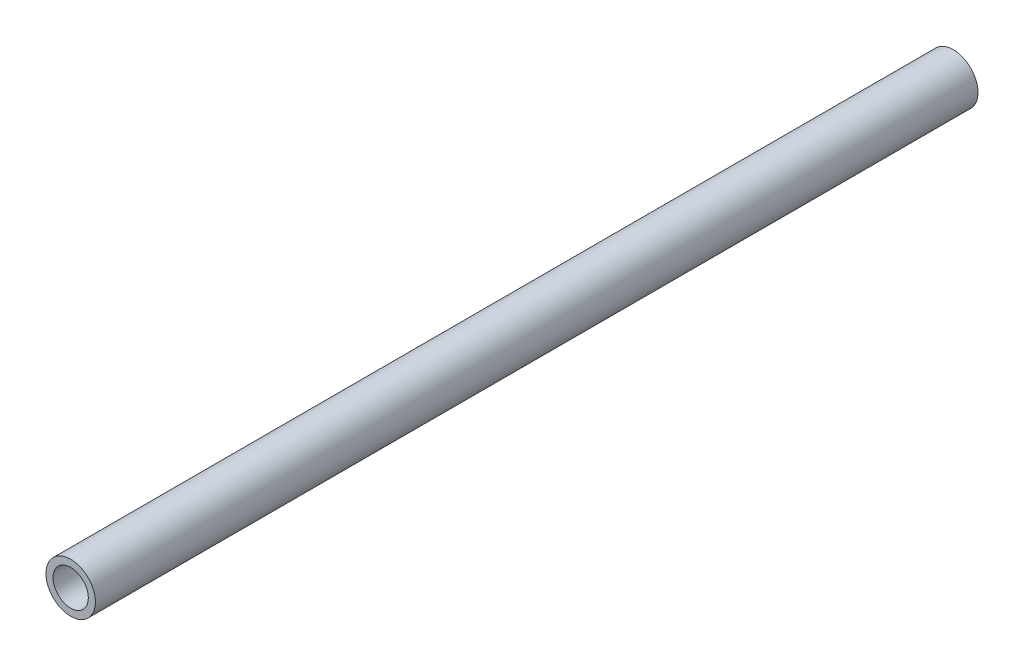
ISO-10303-21;
HEADER;
FILE_DESCRIPTION(('STEP AP214'),'2;1');
FILE_NAME('part.step','',(''),(''),'','','');
FILE_SCHEMA(('AUTOMOTIVE_DESIGN { 1 0 10303 214 1 1 1 1 }'));
ENDSEC;
DATA;
#1=APPLICATION_CONTEXT('core data for automotive mechanical design processes');
#2=APPLICATION_PROTOCOL_DEFINITION('international standard','automotive_design',2000,#1);
#3=PRODUCT_CONTEXT('',#1,'mechanical');
#4=PRODUCT('Part','Part','',(#3));
#5=PRODUCT_RELATED_PRODUCT_CATEGORY('part','',(#4));
#6=PRODUCT_DEFINITION_FORMATION('','',#4);
#7=PRODUCT_DEFINITION_CONTEXT('part definition',#1,'design');
#8=PRODUCT_DEFINITION('design','',#6,#7);
#9=PRODUCT_DEFINITION_SHAPE('','',#8);
#10=(LENGTH_UNIT() NAMED_UNIT(*) SI_UNIT(.MILLI.,.METRE.));
#11=(NAMED_UNIT(*) PLANE_ANGLE_UNIT() SI_UNIT($,.RADIAN.));
#12=(NAMED_UNIT(*) SI_UNIT($,.STERADIAN.) SOLID_ANGLE_UNIT());
#13=UNCERTAINTY_MEASURE_WITH_UNIT(LENGTH_MEASURE(1.E-05),#10,'distance_accuracy_value','');
#14=(GEOMETRIC_REPRESENTATION_CONTEXT(3) GLOBAL_UNCERTAINTY_ASSIGNED_CONTEXT((#13)) GLOBAL_UNIT_ASSIGNED_CONTEXT((#10,
#11,#12)) REPRESENTATION_CONTEXT('',''));
#15=CARTESIAN_POINT('',(0.,0.,0.));
#16=DIRECTION('',(0.,0.,1.));
#17=DIRECTION('',(1.,0.,0.));
#18=AXIS2_PLACEMENT_3D('',#15,#16,#17);
#19=CARTESIAN_POINT('',(0.,0.,250.));
#20=DIRECTION('',(0.,0.,1.));
#21=DIRECTION('',(1.,0.,0.));
#22=AXIS2_PLACEMENT_3D('',#19,#20,#21);
#23=PLANE('',#22);
#24=CARTESIAN_POINT('',(0.,0.,250.));
#25=DIRECTION('',(0.,0.,1.));
#26=DIRECTION('',(1.,0.,0.));
#27=AXIS2_PLACEMENT_3D('',#24,#25,#26);
#28=CIRCLE('',#27,7.);
#29=CARTESIAN_POINT('',(7.,0.,250.));
#30=VERTEX_POINT('',#29);
#31=EDGE_CURVE('E10',#30,#30,#28,.T.);
#32=ORIENTED_EDGE('',*,*,#31,.T.);
#33=EDGE_LOOP('',(#32));
#34=FACE_BOUND('',#33,.T.);
#35=CARTESIAN_POINT('',(0.,0.,250.));
#36=DIRECTION('',(0.,0.,1.));
#37=DIRECTION('',(1.,0.,0.));
#38=AXIS2_PLACEMENT_3D('',#35,#36,#37);
#39=CIRCLE('',#38,5.);
#40=CARTESIAN_POINT('',(5.,0.,250.));
#41=VERTEX_POINT('',#40);
#42=EDGE_CURVE('E52',#41,#41,#39,.T.);
#43=ORIENTED_EDGE('',*,*,#42,.F.);
#44=EDGE_LOOP('',(#43));
#45=FACE_BOUND('',#44,.T.);
#46=ADVANCED_FACE('F39',(#34,#45),#23,.T.);
#47=CARTESIAN_POINT('',(0.,0.,0.));
#48=DIRECTION('',(0.,0.,1.));
#49=DIRECTION('',(1.,0.,0.));
#50=AXIS2_PLACEMENT_3D('',#47,#48,#49);
#51=PLANE('',#50);
#52=CARTESIAN_POINT('',(0.,0.,0.));
#53=DIRECTION('',(0.,0.,1.));
#54=DIRECTION('',(1.,0.,0.));
#55=AXIS2_PLACEMENT_3D('',#52,#53,#54);
#56=CIRCLE('',#55,7.);
#57=CARTESIAN_POINT('',(7.,0.,0.));
#58=VERTEX_POINT('',#57);
#59=EDGE_CURVE('E43',#58,#58,#56,.T.);
#60=ORIENTED_EDGE('',*,*,#59,.F.);
#61=EDGE_LOOP('',(#60));
#62=FACE_BOUND('',#61,.T.);
#63=CARTESIAN_POINT('',(0.,0.,0.));
#64=DIRECTION('',(0.,0.,1.));
#65=DIRECTION('',(1.,0.,0.));
#66=AXIS2_PLACEMENT_3D('',#63,#64,#65);
#67=CIRCLE('',#66,5.);
#68=CARTESIAN_POINT('',(5.,0.,0.));
#69=VERTEX_POINT('',#68);
#70=EDGE_CURVE('E54',#69,#69,#67,.T.);
#71=ORIENTED_EDGE('',*,*,#70,.T.);
#72=EDGE_LOOP('',(#71));
#73=FACE_BOUND('',#72,.T.);
#74=ADVANCED_FACE('F66',(#62,#73),#51,.F.);
#75=CARTESIAN_POINT('',(0.,0.,250.));
#76=DIRECTION('',(0.,0.,-1.));
#77=DIRECTION('',(-1.,0.,0.));
#78=AXIS2_PLACEMENT_3D('',#75,#76,#77);
#79=CYLINDRICAL_SURFACE('',#78,7.);
#80=ORIENTED_EDGE('',*,*,#31,.F.);
#81=EDGE_LOOP('',(#80));
#82=FACE_BOUND('',#81,.T.);
#83=ORIENTED_EDGE('',*,*,#59,.T.);
#84=EDGE_LOOP('',(#83));
#85=FACE_BOUND('',#84,.T.);
#86=ADVANCED_FACE('F41',(#82,#85),#79,.T.);
#87=CARTESIAN_POINT('',(0.,0.,250.));
#88=DIRECTION('',(0.,0.,-1.));
#89=DIRECTION('',(-1.,0.,0.));
#90=AXIS2_PLACEMENT_3D('',#87,#88,#89);
#91=CYLINDRICAL_SURFACE('',#90,5.);
#92=ORIENTED_EDGE('',*,*,#42,.T.);
#93=EDGE_LOOP('',(#92));
#94=FACE_BOUND('',#93,.T.);
#95=ORIENTED_EDGE('',*,*,#70,.F.);
#96=EDGE_LOOP('',(#95));
#97=FACE_BOUND('',#96,.T.);
#98=ADVANCED_FACE('F62',(#94,#97),#91,.F.);
#99=CLOSED_SHELL('',(#46,#74,#86,#98));
#100=MANIFOLD_SOLID_BREP('B2',#99);
#101=ADVANCED_BREP_SHAPE_REPRESENTATION('',(#18,#100),#14);
#102=SHAPE_DEFINITION_REPRESENTATION(#9,#101);
ENDSEC;
END-ISO-10303-21;
